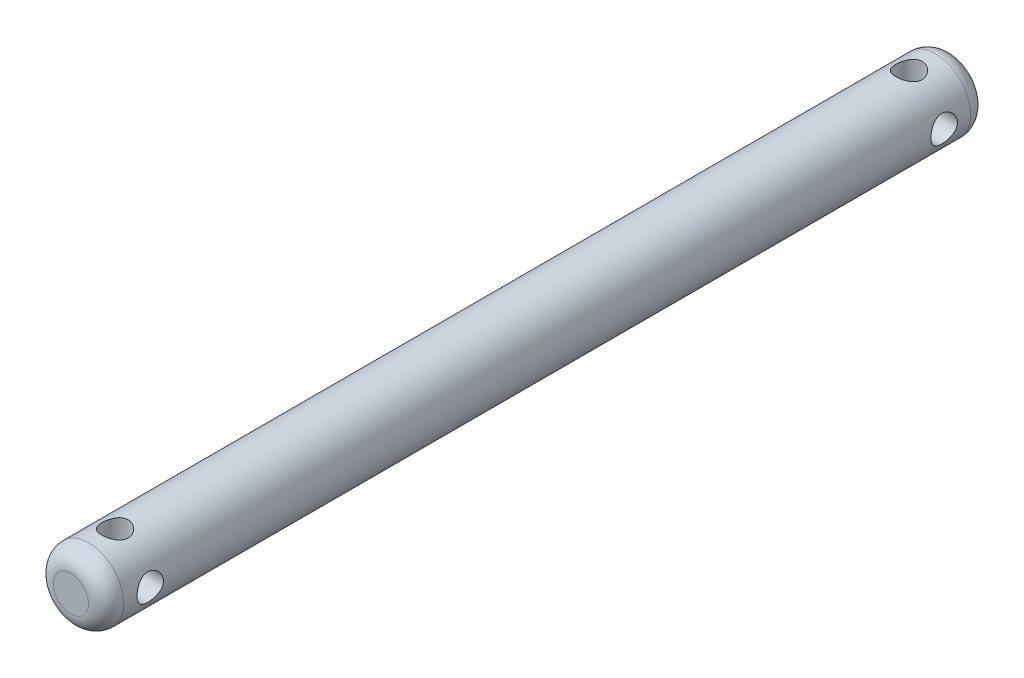
ISO-10303-21;
HEADER;
FILE_DESCRIPTION(('STEP AP214'),'2;1');
FILE_NAME('part.step','',(''),(''),'','','');
FILE_SCHEMA(('AUTOMOTIVE_DESIGN { 1 0 10303 214 1 1 1 1 }'));
ENDSEC;
DATA;
#1=APPLICATION_CONTEXT('core data for automotive mechanical design processes');
#2=APPLICATION_PROTOCOL_DEFINITION('international standard','automotive_design',2000,#1);
#3=PRODUCT_CONTEXT('',#1,'mechanical');
#4=PRODUCT('Part','Part','',(#3));
#5=PRODUCT_RELATED_PRODUCT_CATEGORY('part','',(#4));
#6=PRODUCT_DEFINITION_FORMATION('','',#4);
#7=PRODUCT_DEFINITION_CONTEXT('part definition',#1,'design');
#8=PRODUCT_DEFINITION('design','',#6,#7);
#9=PRODUCT_DEFINITION_SHAPE('','',#8);
#10=(LENGTH_UNIT() NAMED_UNIT(*) SI_UNIT(.MILLI.,.METRE.));
#11=(NAMED_UNIT(*) PLANE_ANGLE_UNIT() SI_UNIT($,.RADIAN.));
#12=(NAMED_UNIT(*) SI_UNIT($,.STERADIAN.) SOLID_ANGLE_UNIT());
#13=UNCERTAINTY_MEASURE_WITH_UNIT(LENGTH_MEASURE(1.E-05),#10,'distance_accuracy_value','');
#14=(GEOMETRIC_REPRESENTATION_CONTEXT(3) GLOBAL_UNCERTAINTY_ASSIGNED_CONTEXT((#13)) GLOBAL_UNIT_ASSIGNED_CONTEXT((#10,
#11,#12)) REPRESENTATION_CONTEXT('',''));
#15=CARTESIAN_POINT('',(0.,0.,0.));
#16=DIRECTION('',(0.,0.,1.));
#17=DIRECTION('',(1.,0.,0.));
#18=AXIS2_PLACEMENT_3D('',#15,#16,#17);
#19=CARTESIAN_POINT('',(0.,0.,50.));
#20=DIRECTION('',(0.,0.,-1.));
#21=DIRECTION('',(-1.,0.,0.));
#22=AXIS2_PLACEMENT_3D('',#19,#20,#21);
#23=CYLINDRICAL_SURFACE('',#22,4.);
#24=CARTESIAN_POINT('',(0.,0.,-48.));
#25=DIRECTION('',(0.,0.,1.));
#26=DIRECTION('',(1.,0.,0.));
#27=AXIS2_PLACEMENT_3D('',#24,#25,#26);
#28=CIRCLE('',#27,4.);
#29=CARTESIAN_POINT('',(4.,0.,-48.));
#30=VERTEX_POINT('',#29);
#31=EDGE_CURVE('E152',#30,#30,#28,.T.);
#32=ORIENTED_EDGE('',*,*,#31,.T.);
#33=EDGE_LOOP('',(#32));
#34=FACE_BOUND('',#33,.T.);
#35=CARTESIAN_POINT('',(0.,0.,48.));
#36=DIRECTION('',(0.,0.,1.));
#37=DIRECTION('',(1.,0.,0.));
#38=AXIS2_PLACEMENT_3D('',#35,#36,#37);
#39=CIRCLE('',#38,4.);
#40=CARTESIAN_POINT('',(4.,0.,48.));
#41=VERTEX_POINT('',#40);
#42=EDGE_CURVE('E156',#41,#41,#39,.F.);
#43=ORIENTED_EDGE('',*,*,#42,.T.);
#44=EDGE_LOOP('',(#43));
#45=FACE_BOUND('',#44,.T.);
#46=CARTESIAN_POINT('',(4.,0.,-43.5));
#47=CARTESIAN_POINT('',(4.00000217456151,-0.0812350589378528,-43.4999970976969));
#48=CARTESIAN_POINT('',(3.99750379283184,-0.162450241781792,-43.5066197602484));
#49=CARTESIAN_POINT('',(3.98778696006928,-0.32245345235236,-43.5328281952699));
#50=CARTESIAN_POINT('',(3.98056918893993,-0.401241827987615,-43.5524121004706));
#51=CARTESIAN_POINT('',(3.96218832391545,-0.554060784990877,-43.6037530017718));
#52=CARTESIAN_POINT('',(3.9510328434944,-0.628100224162275,-43.6354865168218));
#53=CARTESIAN_POINT('',(3.92588767765353,-0.769799310160251,-43.7101064130158));
#54=CARTESIAN_POINT('',(3.91189723227548,-0.837457239177877,-43.7529957855442));
#55=CARTESIAN_POINT('',(3.88186246971217,-0.967346417045823,-43.8506125310709));
#56=CARTESIAN_POINT('',(3.86576002583566,-1.02927073015119,-43.9057302622594));
#57=CARTESIAN_POINT('',(3.83360220871327,-1.14324421474363,-44.0254104346588));
#58=CARTESIAN_POINT('',(3.81754685135033,-1.19529036359202,-44.0899757560879));
#59=CARTESIAN_POINT('',(3.78662470617731,-1.28998202215985,-44.2297174675232));
#60=CARTESIAN_POINT('',(3.77182648820819,-1.33219393195759,-44.3052043665458));
#61=CARTESIAN_POINT('',(3.74599860237433,-1.40318646334084,-44.4628483541685));
#62=CARTESIAN_POINT('',(3.73496742975881,-1.43197244961239,-44.5450027631551));
#63=CARTESIAN_POINT('',(3.71854412824136,-1.47408431017549,-44.7101167402582));
#64=CARTESIAN_POINT('',(3.71293924350838,-1.48799593218557,-44.7929050384354));
#65=CARTESIAN_POINT('',(3.70738061461215,-1.50179556531648,-44.9598161579938));
#66=CARTESIAN_POINT('',(3.70742453659305,-1.5016893680263,-45.0439384138745));
#67=CARTESIAN_POINT('',(3.71297511632055,-1.48790429610018,-45.205769525213));
#68=CARTESIAN_POINT('',(3.71815468871122,-1.47503808509003,-45.2835609060442));
#69=CARTESIAN_POINT('',(3.7328493805953,-1.4374416786833,-45.4357871504053));
#70=CARTESIAN_POINT('',(3.74236515298863,-1.41270969663258,-45.5102215066139));
#71=CARTESIAN_POINT('',(3.76485702190253,-1.35163748571904,-45.6552770677282));
#72=CARTESIAN_POINT('',(3.77789517988166,-1.31508648737101,-45.7257994861213));
#73=CARTESIAN_POINT('',(3.80594210139319,-1.23156073762698,-45.859945737591));
#74=CARTESIAN_POINT('',(3.82095154457158,-1.18458238728896,-45.9235671775197));
#75=CARTESIAN_POINT('',(3.85248038859113,-1.07781780766548,-46.0466036636509));
#76=CARTESIAN_POINT('',(3.86903347455671,-1.01738298716955,-46.1054486407481));
#77=CARTESIAN_POINT('',(3.90091728164086,-0.887312590819019,-46.2123379662058));
#78=CARTESIAN_POINT('',(3.91624781465952,-0.817675603497361,-46.2603806546057));
#79=CARTESIAN_POINT('',(3.9442639480908,-0.669723436992417,-46.3449303970625));
#80=CARTESIAN_POINT('',(3.95690498259616,-0.591290713844717,-46.3812475812211));
#81=CARTESIAN_POINT('',(3.97778718326962,-0.428836850524582,-46.43998260427));
#82=CARTESIAN_POINT('',(3.98603030341493,-0.344818210845767,-46.4624066165611));
#83=CARTESIAN_POINT('',(3.99684443228065,-0.178375243148666,-46.4916227875419));
#84=CARTESIAN_POINT('',(3.99969369025686,-0.0961036195622102,-46.4991826063825));
#85=CARTESIAN_POINT('',(4.00025893700126,0.0685724752550228,-46.5006910638999));
#86=CARTESIAN_POINT('',(3.99797606386863,0.150976912983371,-46.4946427203168));
#87=CARTESIAN_POINT('',(3.98871709772643,0.310262048561858,-46.4696899576913));
#88=CARTESIAN_POINT('',(3.98192470962305,0.387233328007335,-46.4512884562629));
#89=CARTESIAN_POINT('',(3.96451477091717,0.536941754957219,-46.4028139274527));
#90=CARTESIAN_POINT('',(3.9538967228203,0.609678350347532,-46.372739382052));
#91=CARTESIAN_POINT('',(3.92949624407682,0.751247765110153,-46.3008135875605));
#92=CARTESIAN_POINT('',(3.91563000209348,0.819903083557792,-46.2586422707766));
#93=CARTESIAN_POINT('',(3.88626671564664,0.949392711726622,-46.1640818968284));
#94=CARTESIAN_POINT('',(3.87076907009516,1.01022412027045,-46.1116890674548));
#95=CARTESIAN_POINT('',(3.8387332949099,1.12603079874454,-45.9945958778757));
#96=CARTESIAN_POINT('',(3.82218696503729,1.18046154123568,-45.9293578172273));
#97=CARTESIAN_POINT('',(3.79078815746854,1.27771050031903,-45.7903486152923));
#98=CARTESIAN_POINT('',(3.77593583194399,1.32052767414518,-45.7165767086115));
#99=CARTESIAN_POINT('',(3.74966829822463,1.39337773518997,-45.5619840132277));
#100=CARTESIAN_POINT('',(3.73826760328494,1.42335685446918,-45.4811352540896));
#101=CARTESIAN_POINT('',(3.72054032891005,1.46907883466889,-45.3149902363122));
#102=CARTESIAN_POINT('',(3.71421061057491,1.48483050305535,-45.2296967638019));
#103=CARTESIAN_POINT('',(3.70775894792574,1.50086347097839,-45.0629838404589));
#104=CARTESIAN_POINT('',(3.70726444523341,1.50207331495837,-44.9816673682831));
#105=CARTESIAN_POINT('',(3.71158412745292,1.49136715641592,-44.8200546837238));
#106=CARTESIAN_POINT('',(3.71639780898899,1.47945239850123,-44.7397583753284));
#107=CARTESIAN_POINT('',(3.73048141585433,1.44355815630241,-44.5849527732834));
#108=CARTESIAN_POINT('',(3.73961085376663,1.41995798316524,-44.5103416537547));
#109=CARTESIAN_POINT('',(3.76121548297845,1.36169696779919,-44.3660944915056));
#110=CARTESIAN_POINT('',(3.77369151995215,1.32703332944944,-44.2964597119299));
#111=CARTESIAN_POINT('',(3.80139723903965,1.24552075938153,-44.1601732103024));
#112=CARTESIAN_POINT('',(3.81673698440964,1.1981283280301,-44.0938692032001));
#113=CARTESIAN_POINT('',(3.84806246757177,1.09334485729906,-43.9698584390288));
#114=CARTESIAN_POINT('',(3.86404840943145,1.03595064012808,-43.9121544252132));
#115=CARTESIAN_POINT('',(3.89590424609881,0.90908039678462,-43.8037980441782));
#116=CARTESIAN_POINT('',(3.91172104900645,0.839118644212991,-43.7536962465653));
#117=CARTESIAN_POINT('',(3.94054514457031,0.691213223200821,-43.6659773447234));
#118=CARTESIAN_POINT('',(3.95355221851559,0.613268934090622,-43.6283612122636));
#119=CARTESIAN_POINT('',(3.9757429260668,0.447999082002313,-43.5656231709517));
#120=CARTESIAN_POINT('',(3.98473657158356,0.360413422234209,-43.5411129353981));
#121=CARTESIAN_POINT('',(3.99686242179587,0.181875733606382,-43.5083070400793));
#122=CARTESIAN_POINT('',(3.99999756603967,0.090925416364859,-43.5000032485127));
#123=CARTESIAN_POINT('',(4.,0.,-43.5));
#124=B_SPLINE_CURVE_WITH_KNOTS('',3,(#46,#47,#48,#49,#50,#51,#52,#53,#54,#55,#56,#57,#58,#59,
#60,#61,#62,#63,#64,#65,#66,#67,#68,#69,#70,#71,#72,#73,#74,#75,#76,#77,#78,#79,#80,#81,#82,#83,
#84,#85,#86,#87,#88,#89,#90,#91,#92,#93,#94,#95,#96,#97,#98,#99,#100,#101,#102,#103,#104,#105,
#106,#107,#108,#109,#110,#111,#112,#113,#114,#115,#116,#117,#118,#119,#120,#121,#122,#123),
.UNSPECIFIED.,.T.,.F.,(4,2,2,2,2,2,2,2,2,2,2,2,2,2,2,2,2,2,2,2,2,2,2,2,2,2,2,2,2,2,2,2,2,2,2,2,
2,2,4),(0.,0.243369801560559,0.486704549530459,0.729571369213569,0.972503379609487,
1.22473618582715,1.47704604925621,1.73896674501658,2.00078269352134,2.25185874416901,
2.50283106079707,2.7387834511997,2.97477138060587,3.21522408387017,3.45575990744258,
3.71246153335812,3.96920257905065,4.22991375286074,4.49050899698844,4.73725019635924,
4.98393668390519,5.22114437923839,5.45838293254452,5.70259221859598,5.94689180019866,
6.20536519455656,6.46386178920139,6.72343066727201,6.98283874956505,7.2255876348025,
7.46831350211257,7.70363142426532,7.93900886656505,8.18672471884269,8.4345194199706,
8.69572329654037,8.95694749805099,9.2294851503204,9.50188601796125),.UNSPECIFIED.);
#125=CARTESIAN_POINT('',(4.,0.,-43.5));
#126=VERTEX_POINT('',#125);
#127=EDGE_CURVE('E92',#126,#126,#124,.T.);
#128=ORIENTED_EDGE('',*,*,#127,.F.);
#129=EDGE_LOOP('',(#128));
#130=FACE_BOUND('',#129,.T.);
#131=CARTESIAN_POINT('',(4.,0.,46.5));
#132=CARTESIAN_POINT('',(4.00000217456151,-0.0812350589378528,46.5000029023031));
#133=CARTESIAN_POINT('',(3.99750379283184,-0.162450241781792,46.4933802397516));
#134=CARTESIAN_POINT('',(3.98778696006928,-0.32245345235236,46.4671718047301));
#135=CARTESIAN_POINT('',(3.98056918893993,-0.401241827987615,46.4475878995294));
#136=CARTESIAN_POINT('',(3.96218832391545,-0.554060784990877,46.3962469982282));
#137=CARTESIAN_POINT('',(3.9510328434944,-0.628100224162275,46.3645134831782));
#138=CARTESIAN_POINT('',(3.92588767765353,-0.769799310160251,46.2898935869842));
#139=CARTESIAN_POINT('',(3.91189723227548,-0.837457239177877,46.2470042144558));
#140=CARTESIAN_POINT('',(3.88186246971217,-0.967346417045823,46.1493874689291));
#141=CARTESIAN_POINT('',(3.86576002583566,-1.02927073015119,46.0942697377406));
#142=CARTESIAN_POINT('',(3.83360220871327,-1.14324421474363,45.9745895653412));
#143=CARTESIAN_POINT('',(3.81754685135033,-1.19529036359202,45.9100242439121));
#144=CARTESIAN_POINT('',(3.78662470617731,-1.28998202215985,45.7702825324768));
#145=CARTESIAN_POINT('',(3.77182648820819,-1.33219393195759,45.6947956334542));
#146=CARTESIAN_POINT('',(3.74599860237433,-1.40318646334084,45.5371516458315));
#147=CARTESIAN_POINT('',(3.73496742975881,-1.43197244961239,45.4549972368449));
#148=CARTESIAN_POINT('',(3.71854412824136,-1.47408431017549,45.2898832597418));
#149=CARTESIAN_POINT('',(3.71293924350838,-1.48799593218557,45.2070949615646));
#150=CARTESIAN_POINT('',(3.70738061461215,-1.50179556531648,45.0401838420062));
#151=CARTESIAN_POINT('',(3.70742453659305,-1.5016893680263,44.9560615861255));
#152=CARTESIAN_POINT('',(3.71297511632055,-1.48790429610018,44.794230474787));
#153=CARTESIAN_POINT('',(3.71815468871122,-1.47503808509003,44.7164390939558));
#154=CARTESIAN_POINT('',(3.7328493805953,-1.4374416786833,44.5642128495947));
#155=CARTESIAN_POINT('',(3.74236515298863,-1.41270969663258,44.4897784933861));
#156=CARTESIAN_POINT('',(3.76485702190253,-1.35163748571904,44.3447229322718));
#157=CARTESIAN_POINT('',(3.77789517988166,-1.31508648737101,44.2742005138787));
#158=CARTESIAN_POINT('',(3.80594210139319,-1.23156073762698,44.140054262409));
#159=CARTESIAN_POINT('',(3.82095154457158,-1.18458238728896,44.0764328224803));
#160=CARTESIAN_POINT('',(3.85248038859113,-1.07781780766548,43.9533963363491));
#161=CARTESIAN_POINT('',(3.86903347455671,-1.01738298716955,43.8945513592519));
#162=CARTESIAN_POINT('',(3.90091728164086,-0.887312590819018,43.7876620337942));
#163=CARTESIAN_POINT('',(3.91624781465952,-0.817675603497361,43.7396193453943));
#164=CARTESIAN_POINT('',(3.9442639480908,-0.669723436992418,43.6550696029375));
#165=CARTESIAN_POINT('',(3.95690498259616,-0.59129071384472,43.6187524187789));
#166=CARTESIAN_POINT('',(3.97778718326962,-0.428836850524585,43.56001739573));
#167=CARTESIAN_POINT('',(3.98603030341493,-0.344818210845768,43.5375933834389));
#168=CARTESIAN_POINT('',(3.99684443228065,-0.178375243148666,43.5083772124581));
#169=CARTESIAN_POINT('',(3.99969369025686,-0.0961036195622101,43.5008173936175));
#170=CARTESIAN_POINT('',(4.00025893700126,0.0685724752550228,43.4993089361001));
#171=CARTESIAN_POINT('',(3.99797606386863,0.150976912983371,43.5053572796832));
#172=CARTESIAN_POINT('',(3.98871709772643,0.310262048561858,43.5303100423087));
#173=CARTESIAN_POINT('',(3.98192470962305,0.387233328007335,43.5487115437371));
#174=CARTESIAN_POINT('',(3.96451477091717,0.536941754957219,43.5971860725473));
#175=CARTESIAN_POINT('',(3.9538967228203,0.609678350347532,43.627260617948));
#176=CARTESIAN_POINT('',(3.92949624407682,0.751247765110153,43.6991864124395));
#177=CARTESIAN_POINT('',(3.91563000209348,0.819903083557792,43.7413577292234));
#178=CARTESIAN_POINT('',(3.88626671564664,0.949392711726622,43.8359181031716));
#179=CARTESIAN_POINT('',(3.87076907009516,1.01022412027045,43.8883109325452));
#180=CARTESIAN_POINT('',(3.8387332949099,1.12603079874454,44.0054041221243));
#181=CARTESIAN_POINT('',(3.82218696503729,1.18046154123568,44.0706421827727));
#182=CARTESIAN_POINT('',(3.79078815746854,1.27771050031903,44.2096513847076));
#183=CARTESIAN_POINT('',(3.77593583194399,1.32052767414518,44.2834232913885));
#184=CARTESIAN_POINT('',(3.74966829822463,1.39337773518997,44.4380159867723));
#185=CARTESIAN_POINT('',(3.73826760328493,1.42335685446918,44.5188647459104));
#186=CARTESIAN_POINT('',(3.72054032891005,1.46907883466889,44.6850097636878));
#187=CARTESIAN_POINT('',(3.71421061057491,1.48483050305535,44.7703032361981));
#188=CARTESIAN_POINT('',(3.70775894792574,1.50086347097839,44.9370161595411));
#189=CARTESIAN_POINT('',(3.70726444523341,1.50207331495837,45.0183326317169));
#190=CARTESIAN_POINT('',(3.71158412745292,1.49136715641592,45.1799453162762));
#191=CARTESIAN_POINT('',(3.71639780898899,1.47945239850123,45.2602416246716));
#192=CARTESIAN_POINT('',(3.73048141585433,1.44355815630241,45.4150472267165));
#193=CARTESIAN_POINT('',(3.73961085376663,1.41995798316524,45.4896583462453));
#194=CARTESIAN_POINT('',(3.76121548297845,1.36169696779919,45.6339055084944));
#195=CARTESIAN_POINT('',(3.77369151995215,1.32703332944944,45.7035402880701));
#196=CARTESIAN_POINT('',(3.80139723903965,1.24552075938153,45.8398267896976));
#197=CARTESIAN_POINT('',(3.81673698440964,1.1981283280301,45.9061307967999));
#198=CARTESIAN_POINT('',(3.84806246757177,1.09334485729906,46.0301415609712));
#199=CARTESIAN_POINT('',(3.86404840943145,1.03595064012808,46.0878455747867));
#200=CARTESIAN_POINT('',(3.89590424609881,0.90908039678462,46.1962019558218));
#201=CARTESIAN_POINT('',(3.91172104900645,0.839118644212991,46.2463037534347));
#202=CARTESIAN_POINT('',(3.94054514457031,0.691213223200821,46.3340226552765));
#203=CARTESIAN_POINT('',(3.95355221851559,0.613268934090622,46.3716387877364));
#204=CARTESIAN_POINT('',(3.9757429260668,0.447999082002313,46.4343768290483));
#205=CARTESIAN_POINT('',(3.98473657158356,0.360413422234209,46.4588870646019));
#206=CARTESIAN_POINT('',(3.99686242179587,0.181875733606382,46.4916929599207));
#207=CARTESIAN_POINT('',(3.99999756603967,0.090925416364859,46.4999967514873));
#208=CARTESIAN_POINT('',(4.,0.,46.5));
#209=B_SPLINE_CURVE_WITH_KNOTS('',3,(#131,#132,#133,#134,#135,#136,#137,#138,#139,#140,#141,
#142,#143,#144,#145,#146,#147,#148,#149,#150,#151,#152,#153,#154,#155,#156,#157,#158,#159,#160,
#161,#162,#163,#164,#165,#166,#167,#168,#169,#170,#171,#172,#173,#174,#175,#176,#177,#178,#179,
#180,#181,#182,#183,#184,#185,#186,#187,#188,#189,#190,#191,#192,#193,#194,#195,#196,#197,#198,
#199,#200,#201,#202,#203,#204,#205,#206,#207,#208),.UNSPECIFIED.,.T.,.F.,(4,2,2,2,2,2,2,2,2,2,2,
2,2,2,2,2,2,2,2,2,2,2,2,2,2,2,2,2,2,2,2,2,2,2,2,2,2,2,4),(0.,0.243369801560559,
0.486704549530459,0.729571369213569,0.972503379609487,1.22473618582715,1.47704604925621,
1.73896674501658,2.00078269352134,2.25185874416901,2.50283106079707,2.7387834511997,
2.97477138060587,3.21522408387017,3.45575990744258,3.71246153335812,3.96920257905065,
4.22991375286074,4.49050899698844,4.73725019635924,4.98393668390519,5.22114437923839,
5.45838293254452,5.70259221859598,5.94689180019866,6.20536519455656,6.46386178920139,
6.72343066727202,6.98283874956505,7.2255876348025,7.46831350211257,7.70363142426532,
7.93900886656505,8.18672471884269,8.4345194199706,8.69572329654037,8.95694749805099,
9.2294851503204,9.50188601796125),.UNSPECIFIED.);
#210=CARTESIAN_POINT('',(4.,0.,46.5));
#211=VERTEX_POINT('',#210);
#212=EDGE_CURVE('E98',#211,#211,#209,.T.);
#213=ORIENTED_EDGE('',*,*,#212,.F.);
#214=EDGE_LOOP('',(#213));
#215=FACE_BOUND('',#214,.T.);
#216=CARTESIAN_POINT('',(0.,4.,43.5));
#217=CARTESIAN_POINT('',(-0.0812350589378531,4.00000217456151,43.4999970976969));
#218=CARTESIAN_POINT('',(-0.162450241781792,3.99750379283184,43.5066197602484));
#219=CARTESIAN_POINT('',(-0.322453452352362,3.98778696006928,43.5328281952699));
#220=CARTESIAN_POINT('',(-0.401241827987617,3.98056918893993,43.5524121004706));
#221=CARTESIAN_POINT('',(-0.554060784990879,3.96218832391545,43.6037530017718));
#222=CARTESIAN_POINT('',(-0.628100224162276,3.9510328434944,43.6354865168218));
#223=CARTESIAN_POINT('',(-0.769799310160253,3.92588767765353,43.7101064130158));
#224=CARTESIAN_POINT('',(-0.83745723917788,3.91189723227548,43.7529957855442));
#225=CARTESIAN_POINT('',(-0.967346417045827,3.88186246971217,43.8506125310709));
#226=CARTESIAN_POINT('',(-1.02927073015119,3.86576002583566,43.9057302622594));
#227=CARTESIAN_POINT('',(-1.14324421474363,3.83360220871327,44.0254104346588));
#228=CARTESIAN_POINT('',(-1.19529036359203,3.81754685135033,44.0899757560879));
#229=CARTESIAN_POINT('',(-1.28998202215985,3.78662470617731,44.2297174675232));
#230=CARTESIAN_POINT('',(-1.3321939319576,3.77182648820818,44.3052043665458));
#231=CARTESIAN_POINT('',(-1.40318646334084,3.74599860237433,44.4628483541685));
#232=CARTESIAN_POINT('',(-1.43197244961239,3.73496742975881,44.5450027631551));
#233=CARTESIAN_POINT('',(-1.47408431017549,3.71854412824136,44.7101167402582));
#234=CARTESIAN_POINT('',(-1.48799593218558,3.71293924350838,44.7929050384354));
#235=CARTESIAN_POINT('',(-1.50179556531648,3.70738061461215,44.9598161579938));
#236=CARTESIAN_POINT('',(-1.5016893680263,3.70742453659305,45.0439384138745));
#237=CARTESIAN_POINT('',(-1.48790429610018,3.71297511632055,45.205769525213));
#238=CARTESIAN_POINT('',(-1.47503808509003,3.71815468871122,45.2835609060442));
#239=CARTESIAN_POINT('',(-1.4374416786833,3.7328493805953,45.4357871504053));
#240=CARTESIAN_POINT('',(-1.41270969663258,3.74236515298863,45.5102215066139));
#241=CARTESIAN_POINT('',(-1.35163748571904,3.76485702190253,45.6552770677282));
#242=CARTESIAN_POINT('',(-1.31508648737101,3.77789517988166,45.7257994861213));
#243=CARTESIAN_POINT('',(-1.23156073762698,3.80594210139319,45.859945737591));
#244=CARTESIAN_POINT('',(-1.18458238728897,3.82095154457158,45.9235671775197));
#245=CARTESIAN_POINT('',(-1.07781780766549,3.85248038859113,46.0466036636509));
#246=CARTESIAN_POINT('',(-1.01738298716955,3.86903347455671,46.1054486407481));
#247=CARTESIAN_POINT('',(-0.887312590819018,3.90091728164086,46.2123379662058));
#248=CARTESIAN_POINT('',(-0.817675603497359,3.91624781465952,46.2603806546057));
#249=CARTESIAN_POINT('',(-0.669723436992413,3.9442639480908,46.3449303970625));
#250=CARTESIAN_POINT('',(-0.591290713844713,3.95690498259616,46.3812475812211));
#251=CARTESIAN_POINT('',(-0.42883685052458,3.97778718326962,46.43998260427));
#252=CARTESIAN_POINT('',(-0.344818210845765,3.98603030341493,46.4624066165611));
#253=CARTESIAN_POINT('',(-0.178375243148664,3.99684443228065,46.4916227875419));
#254=CARTESIAN_POINT('',(-0.0961036195622086,3.99969369025686,46.4991826063825));
#255=CARTESIAN_POINT('',(0.0685724752550247,4.00025893700126,46.5006910638999));
#256=CARTESIAN_POINT('',(0.150976912983373,3.99797606386863,46.4946427203168));
#257=CARTESIAN_POINT('',(0.31026204856186,3.98871709772643,46.4696899576913));
#258=CARTESIAN_POINT('',(0.387233328007338,3.98192470962305,46.4512884562629));
#259=CARTESIAN_POINT('',(0.536941754957223,3.96451477091717,46.4028139274527));
#260=CARTESIAN_POINT('',(0.609678350347536,3.9538967228203,46.372739382052));
#261=CARTESIAN_POINT('',(0.751247765110156,3.92949624407681,46.3008135875605));
#262=CARTESIAN_POINT('',(0.819903083557796,3.91563000209348,46.2586422707766));
#263=CARTESIAN_POINT('',(0.949392711726626,3.88626671564664,46.1640818968284));
#264=CARTESIAN_POINT('',(1.01022412027045,3.87076907009516,46.1116890674548));
#265=CARTESIAN_POINT('',(1.12603079874454,3.8387332949099,45.9945958778757));
#266=CARTESIAN_POINT('',(1.18046154123569,3.82218696503729,45.9293578172273));
#267=CARTESIAN_POINT('',(1.27771050031903,3.79078815746854,45.7903486152923));
#268=CARTESIAN_POINT('',(1.32052767414518,3.77593583194399,45.7165767086115));
#269=CARTESIAN_POINT('',(1.39337773518997,3.74966829822463,45.5619840132277));
#270=CARTESIAN_POINT('',(1.42335685446918,3.73826760328493,45.4811352540896));
#271=CARTESIAN_POINT('',(1.46907883466889,3.72054032891005,45.3149902363122));
#272=CARTESIAN_POINT('',(1.48483050305535,3.71421061057491,45.2296967638019));
#273=CARTESIAN_POINT('',(1.50086347097839,3.70775894792573,45.0629838404589));
#274=CARTESIAN_POINT('',(1.50207331495837,3.70726444523341,44.9816673682831));
#275=CARTESIAN_POINT('',(1.49136715641593,3.71158412745292,44.8200546837238));
#276=CARTESIAN_POINT('',(1.47945239850123,3.71639780898899,44.7397583753284));
#277=CARTESIAN_POINT('',(1.44355815630241,3.73048141585433,44.5849527732834));
#278=CARTESIAN_POINT('',(1.41995798316524,3.73961085376663,44.5103416537547));
#279=CARTESIAN_POINT('',(1.36169696779919,3.76121548297845,44.3660944915056));
#280=CARTESIAN_POINT('',(1.32703332944944,3.77369151995215,44.2964597119298));
#281=CARTESIAN_POINT('',(1.24552075938153,3.80139723903965,44.1601732103024));
#282=CARTESIAN_POINT('',(1.1981283280301,3.81673698440964,44.0938692032001));
#283=CARTESIAN_POINT('',(1.09334485729906,3.84806246757177,43.9698584390288));
#284=CARTESIAN_POINT('',(1.03595064012808,3.86404840943145,43.9121544252132));
#285=CARTESIAN_POINT('',(0.909080396784618,3.89590424609881,43.8037980441782));
#286=CARTESIAN_POINT('',(0.839118644212987,3.91172104900645,43.7536962465653));
#287=CARTESIAN_POINT('',(0.691213223200817,3.94054514457031,43.6659773447234));
#288=CARTESIAN_POINT('',(0.613268934090617,3.95355221851559,43.6283612122636));
#289=CARTESIAN_POINT('',(0.447999082002308,3.9757429260668,43.5656231709517));
#290=CARTESIAN_POINT('',(0.360413422234204,3.98473657158356,43.5411129353981));
#291=CARTESIAN_POINT('',(0.181875733606379,3.99686242179587,43.5083070400793));
#292=CARTESIAN_POINT('',(0.0909254163648576,3.99999756603967,43.5000032485127));
#293=CARTESIAN_POINT('',(0.,4.,43.5));
#294=B_SPLINE_CURVE_WITH_KNOTS('',3,(#216,#217,#218,#219,#220,#221,#222,#223,#224,#225,#226,
#227,#228,#229,#230,#231,#232,#233,#234,#235,#236,#237,#238,#239,#240,#241,#242,#243,#244,#245,
#246,#247,#248,#249,#250,#251,#252,#253,#254,#255,#256,#257,#258,#259,#260,#261,#262,#263,#264,
#265,#266,#267,#268,#269,#270,#271,#272,#273,#274,#275,#276,#277,#278,#279,#280,#281,#282,#283,
#284,#285,#286,#287,#288,#289,#290,#291,#292,#293),.UNSPECIFIED.,.T.,.F.,(4,2,2,2,2,2,2,2,2,2,2,
2,2,2,2,2,2,2,2,2,2,2,2,2,2,2,2,2,2,2,2,2,2,2,2,2,2,2,4),(0.,0.243369801560561,
0.486704549530461,0.729571369213571,0.972503379609491,1.22473618582716,1.47704604925622,
1.73896674501659,2.00078269352134,2.25185874416902,2.50283106079707,2.73878345119971,
2.97477138060588,3.21522408387017,3.45575990744258,3.71246153335813,3.96920257905066,
4.22991375286076,4.49050899698846,4.73725019635925,4.9839366839052,5.2211443792384,
5.45838293254454,5.70259221859599,5.94689180019868,6.20536519455657,6.46386178920141,
6.72343066727203,6.98283874956507,7.22558763480252,7.46831350211259,7.70363142426533,
7.93900886656507,8.18672471884271,8.43451941997062,8.69572329654039,8.95694749805102,
9.22948515032042,9.50188601796127),.UNSPECIFIED.);
#295=CARTESIAN_POINT('',(0.,4.,43.5));
#296=VERTEX_POINT('',#295);
#297=EDGE_CURVE('E88',#296,#296,#294,.T.);
#298=ORIENTED_EDGE('',*,*,#297,.F.);
#299=EDGE_LOOP('',(#298));
#300=FACE_BOUND('',#299,.T.);
#301=CARTESIAN_POINT('',(0.,4.,-46.5));
#302=CARTESIAN_POINT('',(-0.0812350589378531,4.00000217456151,-46.5000029023031));
#303=CARTESIAN_POINT('',(-0.162450241781793,3.99750379283184,-46.4933802397516));
#304=CARTESIAN_POINT('',(-0.322453452352361,3.98778696006928,-46.4671718047301));
#305=CARTESIAN_POINT('',(-0.401241827987616,3.98056918893993,-46.4475878995294));
#306=CARTESIAN_POINT('',(-0.55406078499088,3.96218832391545,-46.3962469982282));
#307=CARTESIAN_POINT('',(-0.62810022416228,3.9510328434944,-46.3645134831782));
#308=CARTESIAN_POINT('',(-0.769799310160257,3.92588767765353,-46.2898935869842));
#309=CARTESIAN_POINT('',(-0.837457239177882,3.91189723227548,-46.2470042144558));
#310=CARTESIAN_POINT('',(-0.967346417045827,3.88186246971217,-46.1493874689291));
#311=CARTESIAN_POINT('',(-1.02927073015119,3.86576002583566,-46.0942697377406));
#312=CARTESIAN_POINT('',(-1.14324421474363,3.83360220871327,-45.9745895653412));
#313=CARTESIAN_POINT('',(-1.19529036359203,3.81754685135033,-45.9100242439121));
#314=CARTESIAN_POINT('',(-1.28998202215985,3.78662470617731,-45.7702825324768));
#315=CARTESIAN_POINT('',(-1.3321939319576,3.77182648820818,-45.6947956334542));
#316=CARTESIAN_POINT('',(-1.40318646334084,3.74599860237433,-45.5371516458315));
#317=CARTESIAN_POINT('',(-1.43197244961239,3.73496742975881,-45.4549972368449));
#318=CARTESIAN_POINT('',(-1.47408431017549,3.71854412824136,-45.2898832597418));
#319=CARTESIAN_POINT('',(-1.48799593218558,3.71293924350838,-45.2070949615646));
#320=CARTESIAN_POINT('',(-1.50179556531648,3.70738061461215,-45.0401838420062));
#321=CARTESIAN_POINT('',(-1.5016893680263,3.70742453659305,-44.9560615861255));
#322=CARTESIAN_POINT('',(-1.48790429610018,3.71297511632055,-44.794230474787));
#323=CARTESIAN_POINT('',(-1.47503808509003,3.71815468871122,-44.7164390939558));
#324=CARTESIAN_POINT('',(-1.4374416786833,3.7328493805953,-44.5642128495947));
#325=CARTESIAN_POINT('',(-1.41270969663258,3.74236515298863,-44.4897784933861));
#326=CARTESIAN_POINT('',(-1.35163748571904,3.76485702190253,-44.3447229322718));
#327=CARTESIAN_POINT('',(-1.315086487371,3.77789517988166,-44.2742005138787));
#328=CARTESIAN_POINT('',(-1.23156073762698,3.80594210139319,-44.140054262409));
#329=CARTESIAN_POINT('',(-1.18458238728896,3.82095154457158,-44.0764328224803));
#330=CARTESIAN_POINT('',(-1.07781780766549,3.85248038859113,-43.9533963363491));
#331=CARTESIAN_POINT('',(-1.01738298716956,3.86903347455671,-43.8945513592519));
#332=CARTESIAN_POINT('',(-0.887312590819018,3.90091728164086,-43.7876620337942));
#333=CARTESIAN_POINT('',(-0.817675603497359,3.91624781465952,-43.7396193453943));
#334=CARTESIAN_POINT('',(-0.669723436992413,3.9442639480908,-43.6550696029375));
#335=CARTESIAN_POINT('',(-0.591290713844713,3.95690498259616,-43.6187524187789));
#336=CARTESIAN_POINT('',(-0.428836850524578,3.97778718326962,-43.56001739573));
#337=CARTESIAN_POINT('',(-0.344818210845763,3.98603030341493,-43.5375933834389));
#338=CARTESIAN_POINT('',(-0.178375243148662,3.99684443228065,-43.5083772124581));
#339=CARTESIAN_POINT('',(-0.0961036195622071,3.99969369025686,-43.5008173936175));
#340=CARTESIAN_POINT('',(0.0685724752550253,4.00025893700126,-43.4993089361001));
#341=CARTESIAN_POINT('',(0.150976912983373,3.99797606386863,-43.5053572796832));
#342=CARTESIAN_POINT('',(0.31026204856186,3.98871709772643,-43.5303100423087));
#343=CARTESIAN_POINT('',(0.387233328007337,3.98192470962305,-43.5487115437371));
#344=CARTESIAN_POINT('',(0.536941754957222,3.96451477091717,-43.5971860725473));
#345=CARTESIAN_POINT('',(0.609678350347535,3.9538967228203,-43.627260617948));
#346=CARTESIAN_POINT('',(0.751247765110155,3.92949624407681,-43.6991864124395));
#347=CARTESIAN_POINT('',(0.819903083557796,3.91563000209348,-43.7413577292234));
#348=CARTESIAN_POINT('',(0.949392711726626,3.88626671564664,-43.8359181031716));
#349=CARTESIAN_POINT('',(1.01022412027045,3.87076907009516,-43.8883109325452));
#350=CARTESIAN_POINT('',(1.12603079874454,3.8387332949099,-44.0054041221243));
#351=CARTESIAN_POINT('',(1.18046154123569,3.82218696503729,-44.0706421827727));
#352=CARTESIAN_POINT('',(1.27771050031903,3.79078815746854,-44.2096513847076));
#353=CARTESIAN_POINT('',(1.32052767414518,3.77593583194399,-44.2834232913885));
#354=CARTESIAN_POINT('',(1.39337773518998,3.74966829822463,-44.4380159867723));
#355=CARTESIAN_POINT('',(1.42335685446918,3.73826760328493,-44.5188647459104));
#356=CARTESIAN_POINT('',(1.46907883466889,3.72054032891005,-44.6850097636878));
#357=CARTESIAN_POINT('',(1.48483050305535,3.71421061057491,-44.7703032361981));
#358=CARTESIAN_POINT('',(1.50086347097839,3.70775894792573,-44.9370161595411));
#359=CARTESIAN_POINT('',(1.50207331495837,3.70726444523341,-45.0183326317169));
#360=CARTESIAN_POINT('',(1.49136715641593,3.71158412745292,-45.1799453162762));
#361=CARTESIAN_POINT('',(1.47945239850123,3.71639780898899,-45.2602416246716));
#362=CARTESIAN_POINT('',(1.44355815630241,3.73048141585432,-45.4150472267165));
#363=CARTESIAN_POINT('',(1.41995798316524,3.73961085376663,-45.4896583462453));
#364=CARTESIAN_POINT('',(1.36169696779919,3.76121548297845,-45.6339055084944));
#365=CARTESIAN_POINT('',(1.32703332944944,3.77369151995215,-45.7035402880701));
#366=CARTESIAN_POINT('',(1.24552075938153,3.80139723903965,-45.8398267896976));
#367=CARTESIAN_POINT('',(1.1981283280301,3.81673698440964,-45.9061307967999));
#368=CARTESIAN_POINT('',(1.09334485729906,3.84806246757177,-46.0301415609712));
#369=CARTESIAN_POINT('',(1.03595064012808,3.86404840943145,-46.0878455747868));
#370=CARTESIAN_POINT('',(0.909080396784617,3.89590424609881,-46.1962019558218));
#371=CARTESIAN_POINT('',(0.839118644212987,3.91172104900645,-46.2463037534347));
#372=CARTESIAN_POINT('',(0.691213223200816,3.94054514457031,-46.3340226552766));
#373=CARTESIAN_POINT('',(0.613268934090617,3.95355221851559,-46.3716387877364));
#374=CARTESIAN_POINT('',(0.447999082002309,3.9757429260668,-46.4343768290483));
#375=CARTESIAN_POINT('',(0.360413422234206,3.98473657158356,-46.4588870646019));
#376=CARTESIAN_POINT('',(0.181875733606381,3.99686242179587,-46.4916929599207));
#377=CARTESIAN_POINT('',(0.0909254163648587,3.99999756603967,-46.4999967514873));
#378=CARTESIAN_POINT('',(0.,4.,-46.5));
#379=B_SPLINE_CURVE_WITH_KNOTS('',3,(#301,#302,#303,#304,#305,#306,#307,#308,#309,#310,#311,
#312,#313,#314,#315,#316,#317,#318,#319,#320,#321,#322,#323,#324,#325,#326,#327,#328,#329,#330,
#331,#332,#333,#334,#335,#336,#337,#338,#339,#340,#341,#342,#343,#344,#345,#346,#347,#348,#349,
#350,#351,#352,#353,#354,#355,#356,#357,#358,#359,#360,#361,#362,#363,#364,#365,#366,#367,#368,
#369,#370,#371,#372,#373,#374,#375,#376,#377,#378),.UNSPECIFIED.,.T.,.F.,(4,2,2,2,2,2,2,2,2,2,2,
2,2,2,2,2,2,2,2,2,2,2,2,2,2,2,2,2,2,2,2,2,2,2,2,2,2,2,4),(0.,0.243369801560561,
0.486704549530461,0.729571369213576,0.972503379609491,1.22473618582716,1.47704604925622,
1.73896674501659,2.00078269352134,2.25185874416902,2.50283106079707,2.73878345119971,
2.97477138060588,3.21522408387018,3.45575990744258,3.71246153335813,3.96920257905066,
4.22991375286076,4.49050899698846,4.73725019635925,4.9839366839052,5.2211443792384,
5.45838293254453,5.70259221859599,5.94689180019868,6.20536519455657,6.46386178920141,
6.72343066727204,6.98283874956507,7.22558763480252,7.46831350211259,7.70363142426533,
7.93900886656507,8.18672471884272,8.43451941997062,8.69572329654039,8.95694749805102,
9.22948515032042,9.50188601796127),.UNSPECIFIED.);
#380=CARTESIAN_POINT('',(0.,4.,-46.5));
#381=VERTEX_POINT('',#380);
#382=EDGE_CURVE('E101',#381,#381,#379,.T.);
#383=ORIENTED_EDGE('',*,*,#382,.F.);
#384=EDGE_LOOP('',(#383));
#385=FACE_BOUND('',#384,.T.);
#386=ADVANCED_FACE('F43',(#34,#45,#130,#215,#300,#385),#23,.T.);
#387=CARTESIAN_POINT('',(5.,0.,-45.));
#388=DIRECTION('',(-1.,0.,0.));
#389=DIRECTION('',(0.,0.,1.));
#390=AXIS2_PLACEMENT_3D('',#387,#388,#389);
#391=CYLINDRICAL_SURFACE('',#390,1.5);
#392=ORIENTED_EDGE('',*,*,#127,.T.);
#393=EDGE_LOOP('',(#392));
#394=FACE_BOUND('',#393,.T.);
#395=CARTESIAN_POINT('',(0.,0.,-45.));
#396=DIRECTION('',(1.,0.,0.));
#397=DIRECTION('',(0.,0.,-1.));
#398=AXIS2_PLACEMENT_3D('',#395,#396,#397);
#399=CIRCLE('',#398,1.5);
#400=CARTESIAN_POINT('',(0.,0.,-43.5));
#401=VERTEX_POINT('',#400);
#402=CARTESIAN_POINT('',(0.,0.,-46.5));
#403=VERTEX_POINT('',#402);
#404=EDGE_CURVE('E93',#401,#403,#399,.T.);
#405=ORIENTED_EDGE('',*,*,#404,.F.);
#406=CARTESIAN_POINT('',(0.,0.,-45.));
#407=DIRECTION('',(-0.707106781186547,0.707106781186547,0.));
#408=DIRECTION('',(-0.707106781186547,-0.707106781186547,0.));
#409=AXIS2_PLACEMENT_3D('',#406,#407,#408);
#410=ELLIPSE('',#409,2.12132034355964,1.5);
#411=EDGE_CURVE('E169',#401,#403,#410,.T.);
#412=ORIENTED_EDGE('',*,*,#411,.T.);
#413=EDGE_LOOP('',(#405,#412));
#414=FACE_BOUND('',#413,.T.);
#415=ADVANCED_FACE('F122',(#394,#414),#391,.F.);
#416=CARTESIAN_POINT('',(0.,0.,-45.));
#417=DIRECTION('',(1.,0.,0.));
#418=DIRECTION('',(0.,0.,-1.));
#419=AXIS2_PLACEMENT_3D('',#416,#417,#418);
#420=PLANE('',#419);
#421=ORIENTED_EDGE('',*,*,#404,.T.);
#422=DIRECTION('',(0.,0.,1.));
#423=VECTOR('',#422,1.);
#424=CARTESIAN_POINT('',(0.,0.,-45.));
#425=LINE('',#424,#423);
#426=EDGE_CURVE('E11',#403,#401,#425,.T.);
#427=ORIENTED_EDGE('',*,*,#426,.T.);
#428=EDGE_LOOP('',(#421,#427));
#429=FACE_BOUND('',#428,.T.);
#430=ADVANCED_FACE('F126',(#429),#420,.T.);
#431=CARTESIAN_POINT('',(5.,0.,45.));
#432=DIRECTION('',(-1.,0.,0.));
#433=DIRECTION('',(0.,0.,1.));
#434=AXIS2_PLACEMENT_3D('',#431,#432,#433);
#435=CYLINDRICAL_SURFACE('',#434,1.5);
#436=ORIENTED_EDGE('',*,*,#212,.T.);
#437=EDGE_LOOP('',(#436));
#438=FACE_BOUND('',#437,.T.);
#439=CARTESIAN_POINT('',(0.,0.,45.));
#440=DIRECTION('',(1.,0.,0.));
#441=DIRECTION('',(0.,0.,-1.));
#442=AXIS2_PLACEMENT_3D('',#439,#440,#441);
#443=CIRCLE('',#442,1.5);
#444=CARTESIAN_POINT('',(0.,0.,46.5));
#445=VERTEX_POINT('',#444);
#446=CARTESIAN_POINT('',(0.,0.,43.5));
#447=VERTEX_POINT('',#446);
#448=EDGE_CURVE('E86',#445,#447,#443,.T.);
#449=ORIENTED_EDGE('',*,*,#448,.F.);
#450=CARTESIAN_POINT('',(0.,0.,45.));
#451=DIRECTION('',(-0.707106781186547,0.707106781186547,0.));
#452=DIRECTION('',(-0.707106781186547,-0.707106781186547,0.));
#453=AXIS2_PLACEMENT_3D('',#450,#451,#452);
#454=ELLIPSE('',#453,2.12132034355964,1.5);
#455=EDGE_CURVE('E81',#445,#447,#454,.T.);
#456=ORIENTED_EDGE('',*,*,#455,.T.);
#457=EDGE_LOOP('',(#449,#456));
#458=FACE_BOUND('',#457,.T.);
#459=ADVANCED_FACE('F85',(#438,#458),#435,.F.);
#460=CARTESIAN_POINT('',(0.,0.,45.));
#461=DIRECTION('',(1.,0.,0.));
#462=DIRECTION('',(0.,0.,-1.));
#463=AXIS2_PLACEMENT_3D('',#460,#461,#462);
#464=PLANE('',#463);
#465=ORIENTED_EDGE('',*,*,#448,.T.);
#466=DIRECTION('',(0.,0.,1.));
#467=VECTOR('',#466,1.);
#468=CARTESIAN_POINT('',(0.,0.,45.));
#469=LINE('',#468,#467);
#470=EDGE_CURVE('E52',#447,#445,#469,.T.);
#471=ORIENTED_EDGE('',*,*,#470,.T.);
#472=EDGE_LOOP('',(#465,#471));
#473=FACE_BOUND('',#472,.T.);
#474=ADVANCED_FACE('F90',(#473),#464,.T.);
#475=CARTESIAN_POINT('',(0.,0.,50.));
#476=DIRECTION('',(0.,0.,1.));
#477=DIRECTION('',(1.,0.,0.));
#478=AXIS2_PLACEMENT_3D('',#475,#476,#477);
#479=PLANE('',#478);
#480=CARTESIAN_POINT('',(0.,0.,50.));
#481=DIRECTION('',(0.,0.,1.));
#482=DIRECTION('',(1.,0.,0.));
#483=AXIS2_PLACEMENT_3D('',#480,#481,#482);
#484=CIRCLE('',#483,2.);
#485=CARTESIAN_POINT('',(2.,0.,50.));
#486=VERTEX_POINT('',#485);
#487=EDGE_CURVE('E76',#486,#486,#484,.T.);
#488=ORIENTED_EDGE('',*,*,#487,.T.);
#489=EDGE_LOOP('',(#488));
#490=FACE_BOUND('',#489,.T.);
#491=ADVANCED_FACE('F133',(#490),#479,.T.);
#492=CARTESIAN_POINT('',(0.,0.,-50.));
#493=DIRECTION('',(0.,0.,1.));
#494=DIRECTION('',(1.,0.,0.));
#495=AXIS2_PLACEMENT_3D('',#492,#493,#494);
#496=PLANE('',#495);
#497=CARTESIAN_POINT('',(0.,0.,-50.));
#498=DIRECTION('',(0.,0.,1.));
#499=DIRECTION('',(1.,0.,0.));
#500=AXIS2_PLACEMENT_3D('',#497,#498,#499);
#501=CIRCLE('',#500,2.);
#502=CARTESIAN_POINT('',(2.,0.,-50.));
#503=VERTEX_POINT('',#502);
#504=EDGE_CURVE('E197',#503,#503,#501,.F.);
#505=ORIENTED_EDGE('',*,*,#504,.T.);
#506=EDGE_LOOP('',(#505));
#507=FACE_BOUND('',#506,.T.);
#508=ADVANCED_FACE('F135',(#507),#496,.F.);
#509=CARTESIAN_POINT('',(0.,0.,-48.));
#510=DIRECTION('',(0.,0.,1.));
#511=DIRECTION('',(1.,0.,0.));
#512=AXIS2_PLACEMENT_3D('',#509,#510,#511);
#513=DEGENERATE_TOROIDAL_SURFACE('',#512,2.,2.,.T.);
#514=ORIENTED_EDGE('',*,*,#504,.F.);
#515=EDGE_LOOP('',(#514));
#516=FACE_BOUND('',#515,.T.);
#517=ORIENTED_EDGE('',*,*,#31,.F.);
#518=EDGE_LOOP('',(#517));
#519=FACE_BOUND('',#518,.T.);
#520=ADVANCED_FACE('F138',(#516,#519),#513,.T.);
#521=CARTESIAN_POINT('',(0.,0.,48.));
#522=DIRECTION('',(0.,0.,1.));
#523=DIRECTION('',(1.,0.,0.));
#524=AXIS2_PLACEMENT_3D('',#521,#522,#523);
#525=DEGENERATE_TOROIDAL_SURFACE('',#524,2.,2.,.T.);
#526=ORIENTED_EDGE('',*,*,#42,.F.);
#527=EDGE_LOOP('',(#526));
#528=FACE_BOUND('',#527,.T.);
#529=ORIENTED_EDGE('',*,*,#487,.F.);
#530=EDGE_LOOP('',(#529));
#531=FACE_BOUND('',#530,.T.);
#532=ADVANCED_FACE('F45',(#528,#531),#525,.T.);
#533=CARTESIAN_POINT('',(0.,4.,45.));
#534=DIRECTION('',(0.,-1.,0.));
#535=DIRECTION('',(0.,0.,-1.));
#536=AXIS2_PLACEMENT_3D('',#533,#534,#535);
#537=CYLINDRICAL_SURFACE('',#536,1.5);
#538=CARTESIAN_POINT('',(0.,0.,45.));
#539=DIRECTION('',(0.,1.,0.));
#540=DIRECTION('',(0.,0.,1.));
#541=AXIS2_PLACEMENT_3D('',#538,#539,#540);
#542=CIRCLE('',#541,1.5);
#543=EDGE_CURVE('E65',#447,#445,#542,.T.);
#544=ORIENTED_EDGE('',*,*,#543,.F.);
#545=ORIENTED_EDGE('',*,*,#455,.F.);
#546=EDGE_LOOP('',(#544,#545));
#547=FACE_BOUND('',#546,.T.);
#548=ORIENTED_EDGE('',*,*,#297,.T.);
#549=EDGE_LOOP('',(#548));
#550=FACE_BOUND('',#549,.T.);
#551=ADVANCED_FACE('F79',(#547,#550),#537,.F.);
#552=CARTESIAN_POINT('',(0.,0.,45.));
#553=DIRECTION('',(0.,1.,0.));
#554=DIRECTION('',(0.,0.,1.));
#555=AXIS2_PLACEMENT_3D('',#552,#553,#554);
#556=PLANE('',#555);
#557=ORIENTED_EDGE('',*,*,#543,.T.);
#558=ORIENTED_EDGE('',*,*,#470,.F.);
#559=EDGE_LOOP('',(#557,#558));
#560=FACE_BOUND('',#559,.T.);
#561=ADVANCED_FACE('F71',(#560),#556,.T.);
#562=CARTESIAN_POINT('',(0.,4.,-45.));
#563=DIRECTION('',(0.,-1.,0.));
#564=DIRECTION('',(0.,0.,-1.));
#565=AXIS2_PLACEMENT_3D('',#562,#563,#564);
#566=CYLINDRICAL_SURFACE('',#565,1.5);
#567=CARTESIAN_POINT('',(0.,0.,-45.));
#568=DIRECTION('',(0.,1.,0.));
#569=DIRECTION('',(0.,0.,1.));
#570=AXIS2_PLACEMENT_3D('',#567,#568,#569);
#571=CIRCLE('',#570,1.5);
#572=EDGE_CURVE('E58',#403,#401,#571,.T.);
#573=ORIENTED_EDGE('',*,*,#572,.F.);
#574=ORIENTED_EDGE('',*,*,#411,.F.);
#575=EDGE_LOOP('',(#573,#574));
#576=FACE_BOUND('',#575,.T.);
#577=ORIENTED_EDGE('',*,*,#382,.T.);
#578=EDGE_LOOP('',(#577));
#579=FACE_BOUND('',#578,.T.);
#580=ADVANCED_FACE('F183',(#576,#579),#566,.F.);
#581=CARTESIAN_POINT('',(0.,0.,-45.));
#582=DIRECTION('',(0.,1.,0.));
#583=DIRECTION('',(0.,0.,1.));
#584=AXIS2_PLACEMENT_3D('',#581,#582,#583);
#585=PLANE('',#584);
#586=ORIENTED_EDGE('',*,*,#572,.T.);
#587=ORIENTED_EDGE('',*,*,#426,.F.);
#588=EDGE_LOOP('',(#586,#587));
#589=FACE_BOUND('',#588,.T.);
#590=ADVANCED_FACE('F226',(#589),#585,.T.);
#591=CLOSED_SHELL('',(#386,#415,#430,#459,#474,#491,#508,#520,#532,#551,#561,#580,#590));
#592=MANIFOLD_SOLID_BREP('B2',#591);
#593=ADVANCED_BREP_SHAPE_REPRESENTATION('',(#18,#592),#14);
#594=SHAPE_DEFINITION_REPRESENTATION(#9,#593);
ENDSEC;
END-ISO-10303-21;
